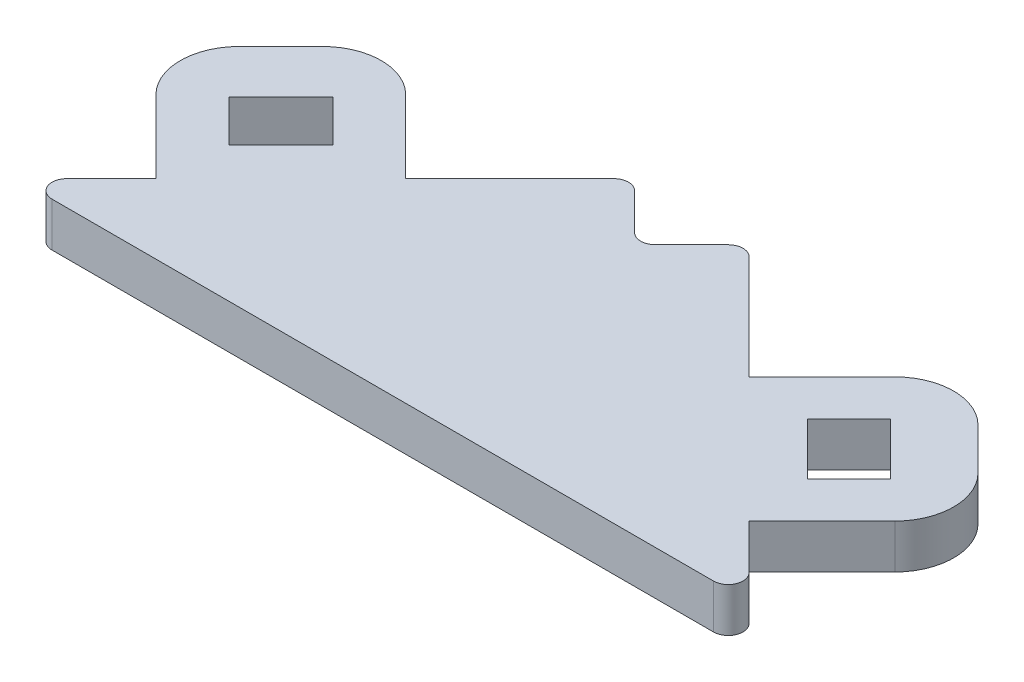
ISO-10303-21;
HEADER;
FILE_DESCRIPTION(('STEP AP214'),'2;1');
FILE_NAME('part.step','',(''),(''),'','','');
FILE_SCHEMA(('AUTOMOTIVE_DESIGN { 1 0 10303 214 1 1 1 1 }'));
ENDSEC;
DATA;
#1=APPLICATION_CONTEXT('core data for automotive mechanical design processes');
#2=APPLICATION_PROTOCOL_DEFINITION('international standard','automotive_design',2000,#1);
#3=PRODUCT_CONTEXT('',#1,'mechanical');
#4=PRODUCT('Part','Part','',(#3));
#5=PRODUCT_RELATED_PRODUCT_CATEGORY('part','',(#4));
#6=PRODUCT_DEFINITION_FORMATION('','',#4);
#7=PRODUCT_DEFINITION_CONTEXT('part definition',#1,'design');
#8=PRODUCT_DEFINITION('design','',#6,#7);
#9=PRODUCT_DEFINITION_SHAPE('','',#8);
#10=(LENGTH_UNIT() NAMED_UNIT(*) SI_UNIT(.MILLI.,.METRE.));
#11=(NAMED_UNIT(*) PLANE_ANGLE_UNIT() SI_UNIT($,.RADIAN.));
#12=(NAMED_UNIT(*) SI_UNIT($,.STERADIAN.) SOLID_ANGLE_UNIT());
#13=UNCERTAINTY_MEASURE_WITH_UNIT(LENGTH_MEASURE(1.E-05),#10,'distance_accuracy_value','');
#14=(GEOMETRIC_REPRESENTATION_CONTEXT(3) GLOBAL_UNCERTAINTY_ASSIGNED_CONTEXT((#13)) GLOBAL_UNIT_ASSIGNED_CONTEXT((#10,
#11,#12)) REPRESENTATION_CONTEXT('',''));
#15=CARTESIAN_POINT('',(0.,0.,0.));
#16=DIRECTION('',(0.,0.,1.));
#17=DIRECTION('',(1.,0.,0.));
#18=AXIS2_PLACEMENT_3D('',#15,#16,#17);
#19=CARTESIAN_POINT('',(167.411152544811,19.05,-133.35));
#20=DIRECTION('',(-0.707106781186547,0.,0.707106781186547));
#21=DIRECTION('',(0.707106781186548,0.,0.707106781186547));
#22=AXIS2_PLACEMENT_3D('',#19,#20,#21);
#23=PLANE('',#22);
#24=DIRECTION('',(-0.707106781186548,0.,-0.707106781186547));
#25=VECTOR('',#24,1.);
#26=CARTESIAN_POINT('',(167.411152544811,0.,-133.35));
#27=LINE('',#26,#25);
#28=CARTESIAN_POINT('',(216.802561210692,0.,-83.9585913341197));
#29=VERTEX_POINT('',#28);
#30=CARTESIAN_POINT('',(171.901280605346,0.,-128.859871939465));
#31=VERTEX_POINT('',#30);
#32=EDGE_CURVE('E316',#29,#31,#27,.T.);
#33=ORIENTED_EDGE('',*,*,#32,.T.);
#34=DIRECTION('',(0.,-1.,0.));
#35=VECTOR('',#34,1.);
#36=CARTESIAN_POINT('',(171.901280605346,19.05,-128.859871939465));
#37=LINE('',#36,#35);
#38=CARTESIAN_POINT('',(171.901280605346,19.05,-128.859871939465));
#39=VERTEX_POINT('',#38);
#40=EDGE_CURVE('E507',#31,#39,#37,.F.);
#41=ORIENTED_EDGE('',*,*,#40,.T.);
#42=DIRECTION('',(-0.707106781186548,0.,-0.707106781186547));
#43=VECTOR('',#42,1.);
#44=CARTESIAN_POINT('',(167.411152544811,19.05,-133.35));
#45=LINE('',#44,#43);
#46=CARTESIAN_POINT('',(216.802561210692,19.05,-83.9585913341197));
#47=VERTEX_POINT('',#46);
#48=EDGE_CURVE('E325',#47,#39,#45,.T.);
#49=ORIENTED_EDGE('',*,*,#48,.F.);
#50=DIRECTION('',(0.,-1.,0.));
#51=VECTOR('',#50,1.);
#52=CARTESIAN_POINT('',(216.802561210692,19.05,-83.9585913341197));
#53=LINE('',#52,#51);
#54=EDGE_CURVE('E370',#47,#29,#53,.T.);
#55=ORIENTED_EDGE('',*,*,#54,.T.);
#56=EDGE_LOOP('',(#33,#41,#49,#55));
#57=FACE_BOUND('',#56,.T.);
#58=ADVANCED_FACE('F34',(#57),#23,.F.);
#59=CARTESIAN_POINT('',(167.411152544811,19.05,-133.35));
#60=DIRECTION('',(0.707106781186548,0.,0.707106781186547));
#61=DIRECTION('',(0.707106781186547,0.,-0.707106781186548));
#62=AXIS2_PLACEMENT_3D('',#59,#60,#61);
#63=PLANE('',#62);
#64=DIRECTION('',(-0.707106781186547,0.,0.707106781186547));
#65=VECTOR('',#64,1.);
#66=CARTESIAN_POINT('',(167.411152544811,0.,-133.35));
#67=LINE('',#66,#65);
#68=CARTESIAN_POINT('',(162.921024484277,0.,-128.859871939465));
#69=VERTEX_POINT('',#68);
#70=CARTESIAN_POINT('',(147.205576272406,0.,-113.144423727594));
#71=VERTEX_POINT('',#70);
#72=EDGE_CURVE('E374',#69,#71,#67,.T.);
#73=ORIENTED_EDGE('',*,*,#72,.T.);
#74=DIRECTION('',(0.,-1.,0.));
#75=VECTOR('',#74,1.);
#76=CARTESIAN_POINT('',(147.205576272406,19.05,-113.144423727594));
#77=LINE('',#76,#75);
#78=CARTESIAN_POINT('',(147.205576272406,19.05,-113.144423727594));
#79=VERTEX_POINT('',#78);
#80=EDGE_CURVE('E505',#71,#79,#77,.F.);
#81=ORIENTED_EDGE('',*,*,#80,.T.);
#82=DIRECTION('',(-0.707106781186547,0.,0.707106781186547));
#83=VECTOR('',#82,1.);
#84=CARTESIAN_POINT('',(167.411152544811,19.05,-133.35));
#85=LINE('',#84,#83);
#86=CARTESIAN_POINT('',(162.921024484277,19.05,-128.859871939465));
#87=VERTEX_POINT('',#86);
#88=EDGE_CURVE('E329',#87,#79,#85,.T.);
#89=ORIENTED_EDGE('',*,*,#88,.F.);
#90=DIRECTION('',(0.,-1.,0.));
#91=VECTOR('',#90,1.);
#92=CARTESIAN_POINT('',(162.921024484277,19.05,-128.859871939465));
#93=LINE('',#92,#91);
#94=EDGE_CURVE('E502',#87,#69,#93,.T.);
#95=ORIENTED_EDGE('',*,*,#94,.T.);
#96=EDGE_LOOP('',(#73,#81,#89,#95));
#97=FACE_BOUND('',#96,.T.);
#98=ADVANCED_FACE('F522',(#97),#63,.F.);
#99=CARTESIAN_POINT('',(142.715448211871,19.05,-108.65429566706));
#100=DIRECTION('',(-0.707106781186547,0.,0.707106781186547));
#101=DIRECTION('',(0.707106781186548,0.,0.707106781186547));
#102=AXIS2_PLACEMENT_3D('',#99,#100,#101);
#103=PLANE('',#102);
#104=DIRECTION('',(-0.707106781186548,0.,-0.707106781186547));
#105=VECTOR('',#104,1.);
#106=CARTESIAN_POINT('',(142.715448211871,19.05,-108.65429566706));
#107=LINE('',#106,#105);
#108=CARTESIAN_POINT('',(138.225320151336,19.05,-113.144423727594));
#109=VERTEX_POINT('',#108);
#110=CARTESIAN_POINT('',(122.509871939465,19.05,-128.859871939465));
#111=VERTEX_POINT('',#110);
#112=EDGE_CURVE('E334',#109,#111,#107,.T.);
#113=ORIENTED_EDGE('',*,*,#112,.F.);
#114=DIRECTION('',(0.,-1.,0.));
#115=VECTOR('',#114,1.);
#116=CARTESIAN_POINT('',(138.225320151336,0.,-113.144423727594));
#117=LINE('',#116,#115);
#118=CARTESIAN_POINT('',(138.225320151336,0.,-113.144423727594));
#119=VERTEX_POINT('',#118);
#120=EDGE_CURVE('E499',#109,#119,#117,.T.);
#121=ORIENTED_EDGE('',*,*,#120,.T.);
#122=DIRECTION('',(-0.707106781186548,0.,-0.707106781186547));
#123=VECTOR('',#122,1.);
#124=CARTESIAN_POINT('',(142.715448211871,0.,-108.65429566706));
#125=LINE('',#124,#123);
#126=CARTESIAN_POINT('',(122.509871939465,0.,-128.859871939465));
#127=VERTEX_POINT('',#126);
#128=EDGE_CURVE('E378',#119,#127,#125,.T.);
#129=ORIENTED_EDGE('',*,*,#128,.T.);
#130=DIRECTION('',(0.,-1.,0.));
#131=VECTOR('',#130,1.);
#132=CARTESIAN_POINT('',(122.509871939465,19.05,-128.859871939465));
#133=LINE('',#132,#131);
#134=EDGE_CURVE('E496',#127,#111,#133,.F.);
#135=ORIENTED_EDGE('',*,*,#134,.T.);
#136=EDGE_LOOP('',(#113,#121,#129,#135));
#137=FACE_BOUND('',#136,.T.);
#138=ADVANCED_FACE('F530',(#137),#103,.F.);
#139=CARTESIAN_POINT('',(118.019743878931,19.05,-133.35));
#140=DIRECTION('',(0.707106781186548,0.,0.707106781186547));
#141=DIRECTION('',(0.707106781186547,0.,-0.707106781186548));
#142=AXIS2_PLACEMENT_3D('',#139,#140,#141);
#143=PLANE('',#142);
#144=DIRECTION('',(-0.707106781186547,0.,0.707106781186547));
#145=VECTOR('',#144,1.);
#146=CARTESIAN_POINT('',(118.019743878931,19.05,-133.35));
#147=LINE('',#146,#145);
#148=CARTESIAN_POINT('',(113.529615818396,19.05,-128.859871939465));
#149=VERTEX_POINT('',#148);
#150=CARTESIAN_POINT('',(68.6283352130505,19.05,-83.9585913341196));
#151=VERTEX_POINT('',#150);
#152=EDGE_CURVE('E337',#149,#151,#147,.T.);
#153=ORIENTED_EDGE('',*,*,#152,.F.);
#154=DIRECTION('',(0.,-1.,0.));
#155=VECTOR('',#154,1.);
#156=CARTESIAN_POINT('',(113.529615818396,19.05,-128.859871939465));
#157=LINE('',#156,#155);
#158=CARTESIAN_POINT('',(113.529615818396,0.,-128.859871939465));
#159=VERTEX_POINT('',#158);
#160=EDGE_CURVE('E509',#149,#159,#157,.T.);
#161=ORIENTED_EDGE('',*,*,#160,.T.);
#162=DIRECTION('',(-0.707106781186547,0.,0.707106781186547));
#163=VECTOR('',#162,1.);
#164=CARTESIAN_POINT('',(118.019743878931,0.,-133.35));
#165=LINE('',#164,#163);
#166=CARTESIAN_POINT('',(68.6283352130505,0.,-83.9585913341196));
#167=VERTEX_POINT('',#166);
#168=EDGE_CURVE('E382',#159,#167,#165,.T.);
#169=ORIENTED_EDGE('',*,*,#168,.T.);
#170=DIRECTION('',(0.,-1.,0.));
#171=VECTOR('',#170,1.);
#172=CARTESIAN_POINT('',(68.6283352130505,19.05,-83.9585913341196));
#173=LINE('',#172,#171);
#174=EDGE_CURVE('E425',#151,#167,#173,.T.);
#175=ORIENTED_EDGE('',*,*,#174,.F.);
#176=EDGE_LOOP('',(#153,#161,#169,#175));
#177=FACE_BOUND('',#176,.T.);
#178=ADVANCED_FACE('F537',(#177),#143,.F.);
#179=CARTESIAN_POINT('',(19.2369265471701,19.05,-133.35));
#180=DIRECTION('',(-0.707106781186547,0.,0.707106781186547));
#181=DIRECTION('',(0.707106781186548,0.,0.707106781186547));
#182=AXIS2_PLACEMENT_3D('',#179,#180,#181);
#183=PLANE('',#182);
#184=DIRECTION('',(-0.707106781186548,0.,-0.707106781186547));
#185=VECTOR('',#184,1.);
#186=CARTESIAN_POINT('',(19.2369265471701,0.,-133.35));
#187=LINE('',#186,#185);
#188=CARTESIAN_POINT('',(37.1974387893084,0.,-115.389487757862));
#189=VERTEX_POINT('',#188);
#190=EDGE_CURVE('E385',#167,#189,#187,.T.);
#191=ORIENTED_EDGE('',*,*,#190,.T.);
#192=DIRECTION('',(0.,-1.,0.));
#193=VECTOR('',#192,1.);
#194=CARTESIAN_POINT('',(37.1974387893084,19.05,-115.389487757862));
#195=LINE('',#194,#193);
#196=CARTESIAN_POINT('',(37.1974387893084,19.05,-115.389487757862));
#197=VERTEX_POINT('',#196);
#198=EDGE_CURVE('E467',#189,#197,#195,.F.);
#199=ORIENTED_EDGE('',*,*,#198,.T.);
#200=DIRECTION('',(-0.707106781186548,0.,-0.707106781186547));
#201=VECTOR('',#200,1.);
#202=CARTESIAN_POINT('',(19.2369265471701,19.05,-133.35));
#203=LINE('',#202,#201);
#204=EDGE_CURVE('E340',#151,#197,#203,.T.);
#205=ORIENTED_EDGE('',*,*,#204,.F.);
#206=ORIENTED_EDGE('',*,*,#174,.T.);
#207=EDGE_LOOP('',(#191,#199,#205,#206));
#208=FACE_BOUND('',#207,.T.);
#209=ADVANCED_FACE('F543',(#208),#183,.F.);
#210=CARTESIAN_POINT('',(-34.6446101792448,19.05,-79.4684632735851));
#211=DIRECTION('',(0.707106781186547,0.,0.707106781186547));
#212=DIRECTION('',(0.707106781186547,0.,-0.707106781186548));
#213=AXIS2_PLACEMENT_3D('',#210,#211,#212);
#214=PLANE('',#213);
#215=DIRECTION('',(-0.707106781186547,0.,0.707106781186548));
#216=VECTOR('',#215,1.);
#217=CARTESIAN_POINT('',(-34.6446101792448,19.05,-79.4684632735851));
#218=LINE('',#217,#216);
#219=CARTESIAN_POINT('',(1.27641430503183,19.05,-115.389487757862));
#220=VERTEX_POINT('',#219);
#221=CARTESIAN_POINT('',(-16.6840979371065,19.05,-97.4289755157234));
#222=VERTEX_POINT('',#221);
#223=EDGE_CURVE('E343',#220,#222,#218,.T.);
#224=ORIENTED_EDGE('',*,*,#223,.F.);
#225=DIRECTION('',(0.,-1.,0.));
#226=VECTOR('',#225,1.);
#227=CARTESIAN_POINT('',(1.27641430503183,19.05,-115.389487757862));
#228=LINE('',#227,#226);
#229=CARTESIAN_POINT('',(1.27641430503183,0.,-115.389487757862));
#230=VERTEX_POINT('',#229);
#231=EDGE_CURVE('E464',#220,#230,#228,.T.);
#232=ORIENTED_EDGE('',*,*,#231,.T.);
#233=DIRECTION('',(-0.707106781186547,0.,0.707106781186548));
#234=VECTOR('',#233,1.);
#235=CARTESIAN_POINT('',(-34.6446101792448,0.,-79.4684632735851));
#236=LINE('',#235,#234);
#237=CARTESIAN_POINT('',(-16.6840979371065,0.,-97.4289755157234));
#238=VERTEX_POINT('',#237);
#239=EDGE_CURVE('E389',#230,#238,#236,.T.);
#240=ORIENTED_EDGE('',*,*,#239,.T.);
#241=DIRECTION('',(0.,-1.,0.));
#242=VECTOR('',#241,1.);
#243=CARTESIAN_POINT('',(-16.6840979371065,19.05,-97.4289755157234));
#244=LINE('',#243,#242);
#245=EDGE_CURVE('E461',#238,#222,#244,.F.);
#246=ORIENTED_EDGE('',*,*,#245,.T.);
#247=EDGE_LOOP('',(#224,#232,#240,#246));
#248=FACE_BOUND('',#247,.T.);
#249=ADVANCED_FACE('F552',(#248),#214,.F.);
#250=CARTESIAN_POINT('',(-34.6446101792448,19.05,-79.4684632735851));
#251=DIRECTION('',(0.707106781186547,0.,-0.707106781186547));
#252=DIRECTION('',(-0.707106781186548,0.,-0.707106781186547));
#253=AXIS2_PLACEMENT_3D('',#250,#251,#252);
#254=PLANE('',#253);
#255=DIRECTION('',(0.707106781186548,0.,0.707106781186547));
#256=VECTOR('',#255,1.);
#257=CARTESIAN_POINT('',(-34.6446101792448,19.05,-79.4684632735851));
#258=LINE('',#257,#256);
#259=CARTESIAN_POINT('',(-16.6840979371065,19.05,-61.5079510314468));
#260=VERTEX_POINT('',#259);
#261=CARTESIAN_POINT('',(14.7467984866356,19.05,-30.0770546077048));
#262=VERTEX_POINT('',#261);
#263=EDGE_CURVE('E347',#260,#262,#258,.T.);
#264=ORIENTED_EDGE('',*,*,#263,.F.);
#265=DIRECTION('',(0.,-1.,0.));
#266=VECTOR('',#265,1.);
#267=CARTESIAN_POINT('',(-16.6840979371065,19.05,-61.5079510314468));
#268=LINE('',#267,#266);
#269=CARTESIAN_POINT('',(-16.6840979371065,0.,-61.5079510314468));
#270=VERTEX_POINT('',#269);
#271=EDGE_CURVE('E470',#260,#270,#268,.T.);
#272=ORIENTED_EDGE('',*,*,#271,.T.);
#273=DIRECTION('',(0.707106781186548,0.,0.707106781186547));
#274=VECTOR('',#273,1.);
#275=CARTESIAN_POINT('',(-34.6446101792448,0.,-79.4684632735851));
#276=LINE('',#275,#274);
#277=CARTESIAN_POINT('',(14.7467984866356,0.,-30.0770546077048));
#278=VERTEX_POINT('',#277);
#279=EDGE_CURVE('E393',#270,#278,#276,.T.);
#280=ORIENTED_EDGE('',*,*,#279,.T.);
#281=DIRECTION('',(0.,-1.,0.));
#282=VECTOR('',#281,1.);
#283=CARTESIAN_POINT('',(14.7467984866356,19.05,-30.0770546077048));
#284=LINE('',#283,#282);
#285=EDGE_CURVE('E421',#262,#278,#284,.T.);
#286=ORIENTED_EDGE('',*,*,#285,.F.);
#287=EDGE_LOOP('',(#264,#272,#280,#286));
#288=FACE_BOUND('',#287,.T.);
#289=ADVANCED_FACE('F560',(#288),#254,.F.);
#290=CARTESIAN_POINT('',(14.7467984866356,19.05,-30.0770546077048));
#291=DIRECTION('',(0.707106781186547,0.,0.707106781186547));
#292=DIRECTION('',(0.707106781186547,0.,-0.707106781186548));
#293=AXIS2_PLACEMENT_3D('',#290,#291,#292);
#294=PLANE('',#293);
#295=DIRECTION('',(-0.707106781186547,0.,0.707106781186548));
#296=VECTOR('',#295,1.);
#297=CARTESIAN_POINT('',(14.7467984866356,0.,-30.0770546077048));
#298=LINE('',#297,#296);
#299=CARTESIAN_POINT('',(-4.49012806053458,0.,-10.8401280605346));
#300=VERTEX_POINT('',#299);
#301=EDGE_CURVE('E396',#278,#300,#298,.T.);
#302=ORIENTED_EDGE('',*,*,#301,.T.);
#303=DIRECTION('',(0.,-1.,0.));
#304=VECTOR('',#303,1.);
#305=CARTESIAN_POINT('',(-4.49012806053458,19.05,-10.8401280605346));
#306=LINE('',#305,#304);
#307=CARTESIAN_POINT('',(-4.49012806053458,19.05,-10.8401280605346));
#308=VERTEX_POINT('',#307);
#309=EDGE_CURVE('E49',#300,#308,#306,.F.);
#310=ORIENTED_EDGE('',*,*,#309,.T.);
#311=DIRECTION('',(-0.707106781186547,0.,0.707106781186548));
#312=VECTOR('',#311,1.);
#313=CARTESIAN_POINT('',(14.7467984866356,19.05,-30.0770546077048));
#314=LINE('',#313,#312);
#315=EDGE_CURVE('E350',#262,#308,#314,.T.);
#316=ORIENTED_EDGE('',*,*,#315,.F.);
#317=ORIENTED_EDGE('',*,*,#285,.T.);
#318=EDGE_LOOP('',(#302,#310,#316,#317));
#319=FACE_BOUND('',#318,.T.);
#320=ADVANCED_FACE('F563',(#319),#294,.F.);
#321=CARTESIAN_POINT('',(-15.3302561210692,19.05,0.));
#322=DIRECTION('',(0.,0.,-1.));
#323=DIRECTION('',(-1.,0.,0.));
#324=AXIS2_PLACEMENT_3D('',#321,#322,#323);
#325=PLANE('',#324);
#326=DIRECTION('',(1.,0.,0.));
#327=VECTOR('',#326,1.);
#328=CARTESIAN_POINT('',(-15.3302561210692,0.,0.));
#329=LINE('',#328,#327);
#330=CARTESIAN_POINT('',(0.,0.,0.));
#331=VERTEX_POINT('',#330);
#332=CARTESIAN_POINT('',(285.430896423742,0.,0.));
#333=VERTEX_POINT('',#332);
#334=EDGE_CURVE('E399',#331,#333,#329,.T.);
#335=ORIENTED_EDGE('',*,*,#334,.T.);
#336=DIRECTION('',(0.,-1.,0.));
#337=VECTOR('',#336,1.);
#338=CARTESIAN_POINT('',(285.430896423742,19.05,0.));
#339=LINE('',#338,#337);
#340=CARTESIAN_POINT('',(285.430896423742,19.05,0.));
#341=VERTEX_POINT('',#340);
#342=EDGE_CURVE('E487',#333,#341,#339,.F.);
#343=ORIENTED_EDGE('',*,*,#342,.T.);
#344=DIRECTION('',(1.,0.,0.));
#345=VECTOR('',#344,1.);
#346=CARTESIAN_POINT('',(-15.3302561210692,19.05,0.));
#347=LINE('',#346,#345);
#348=CARTESIAN_POINT('',(0.,19.05,0.));
#349=VERTEX_POINT('',#348);
#350=EDGE_CURVE('E352',#349,#341,#347,.T.);
#351=ORIENTED_EDGE('',*,*,#350,.F.);
#352=DIRECTION('',(0.,-1.,0.));
#353=VECTOR('',#352,1.);
#354=CARTESIAN_POINT('',(0.,19.05,0.));
#355=LINE('',#354,#353);
#356=EDGE_CURVE('E484',#349,#331,#355,.T.);
#357=ORIENTED_EDGE('',*,*,#356,.T.);
#358=EDGE_LOOP('',(#335,#343,#351,#357));
#359=FACE_BOUND('',#358,.T.);
#360=ADVANCED_FACE('F570',(#359),#325,.F.);
#361=CARTESIAN_POINT('',(300.761152544811,19.05,0.));
#362=DIRECTION('',(-0.707106781186547,0.,0.707106781186547));
#363=DIRECTION('',(0.707106781186548,0.,0.707106781186547));
#364=AXIS2_PLACEMENT_3D('',#361,#362,#363);
#365=PLANE('',#364);
#366=DIRECTION('',(-0.707106781186548,0.,-0.707106781186547));
#367=VECTOR('',#366,1.);
#368=CARTESIAN_POINT('',(300.761152544811,19.05,0.));
#369=LINE('',#368,#367);
#370=CARTESIAN_POINT('',(289.921024484277,19.05,-10.8401280605346));
#371=VERTEX_POINT('',#370);
#372=CARTESIAN_POINT('',(270.684097937106,19.05,-30.0770546077048));
#373=VERTEX_POINT('',#372);
#374=EDGE_CURVE('E356',#371,#373,#369,.T.);
#375=ORIENTED_EDGE('',*,*,#374,.F.);
#376=DIRECTION('',(0.,-1.,0.));
#377=VECTOR('',#376,1.);
#378=CARTESIAN_POINT('',(289.921024484277,19.05,-10.8401280605346));
#379=LINE('',#378,#377);
#380=CARTESIAN_POINT('',(289.921024484277,0.,-10.8401280605346));
#381=VERTEX_POINT('',#380);
#382=EDGE_CURVE('E473',#371,#381,#379,.T.);
#383=ORIENTED_EDGE('',*,*,#382,.T.);
#384=DIRECTION('',(-0.707106781186548,0.,-0.707106781186547));
#385=VECTOR('',#384,1.);
#386=CARTESIAN_POINT('',(300.761152544811,0.,0.));
#387=LINE('',#386,#385);
#388=CARTESIAN_POINT('',(270.684097937106,0.,-30.0770546077048));
#389=VERTEX_POINT('',#388);
#390=EDGE_CURVE('E403',#381,#389,#387,.T.);
#391=ORIENTED_EDGE('',*,*,#390,.T.);
#392=DIRECTION('',(0.,-1.,0.));
#393=VECTOR('',#392,1.);
#394=CARTESIAN_POINT('',(270.684097937106,19.05,-30.0770546077048));
#395=LINE('',#394,#393);
#396=EDGE_CURVE('E417',#373,#389,#395,.T.);
#397=ORIENTED_EDGE('',*,*,#396,.F.);
#398=EDGE_LOOP('',(#375,#383,#391,#397));
#399=FACE_BOUND('',#398,.T.);
#400=ADVANCED_FACE('F579',(#399),#365,.F.);
#401=CARTESIAN_POINT('',(270.684097937106,19.05,-30.0770546077048));
#402=DIRECTION('',(-0.707106781186547,0.,-0.707106781186547));
#403=DIRECTION('',(-0.707106781186547,0.,0.707106781186548));
#404=AXIS2_PLACEMENT_3D('',#401,#402,#403);
#405=PLANE('',#404);
#406=DIRECTION('',(0.707106781186547,0.,-0.707106781186548));
#407=VECTOR('',#406,1.);
#408=CARTESIAN_POINT('',(270.684097937106,0.,-30.0770546077048));
#409=LINE('',#408,#407);
#410=CARTESIAN_POINT('',(302.114994360848,0.,-61.5079510314468));
#411=VERTEX_POINT('',#410);
#412=EDGE_CURVE('E405',#389,#411,#409,.T.);
#413=ORIENTED_EDGE('',*,*,#412,.T.);
#414=DIRECTION('',(0.,-1.,0.));
#415=VECTOR('',#414,1.);
#416=CARTESIAN_POINT('',(302.114994360848,19.05,-61.5079510314468));
#417=LINE('',#416,#415);
#418=CARTESIAN_POINT('',(302.114994360848,19.05,-61.5079510314468));
#419=VERTEX_POINT('',#418);
#420=EDGE_CURVE('E459',#411,#419,#417,.F.);
#421=ORIENTED_EDGE('',*,*,#420,.T.);
#422=DIRECTION('',(0.707106781186547,0.,-0.707106781186548));
#423=VECTOR('',#422,1.);
#424=CARTESIAN_POINT('',(270.684097937106,19.05,-30.0770546077048));
#425=LINE('',#424,#423);
#426=EDGE_CURVE('E359',#373,#419,#425,.T.);
#427=ORIENTED_EDGE('',*,*,#426,.F.);
#428=ORIENTED_EDGE('',*,*,#396,.T.);
#429=EDGE_LOOP('',(#413,#421,#427,#428));
#430=FACE_BOUND('',#429,.T.);
#431=ADVANCED_FACE('F797',(#430),#405,.F.);
#432=CARTESIAN_POINT('',(266.193969876572,19.05,-133.35));
#433=DIRECTION('',(-0.707106781186547,0.,0.707106781186548));
#434=DIRECTION('',(0.707106781186548,0.,0.707106781186547));
#435=AXIS2_PLACEMENT_3D('',#432,#433,#434);
#436=PLANE('',#435);
#437=DIRECTION('',(-0.707106781186547,0.,-0.707106781186547));
#438=VECTOR('',#437,1.);
#439=CARTESIAN_POINT('',(266.193969876572,0.,-133.35));
#440=LINE('',#439,#438);
#441=CARTESIAN_POINT('',(302.114994360848,0.,-97.4289755157234));
#442=VERTEX_POINT('',#441);
#443=CARTESIAN_POINT('',(284.15448211871,0.,-115.389487757862));
#444=VERTEX_POINT('',#443);
#445=EDGE_CURVE('E409',#442,#444,#440,.T.);
#446=ORIENTED_EDGE('',*,*,#445,.T.);
#447=DIRECTION('',(0.,-1.,0.));
#448=VECTOR('',#447,1.);
#449=CARTESIAN_POINT('',(284.15448211871,19.05,-115.389487757862));
#450=LINE('',#449,#448);
#451=CARTESIAN_POINT('',(284.15448211871,19.05,-115.389487757862));
#452=VERTEX_POINT('',#451);
#453=EDGE_CURVE('E446',#444,#452,#450,.F.);
#454=ORIENTED_EDGE('',*,*,#453,.T.);
#455=DIRECTION('',(-0.707106781186547,0.,-0.707106781186547));
#456=VECTOR('',#455,1.);
#457=CARTESIAN_POINT('',(266.193969876572,19.05,-133.35));
#458=LINE('',#457,#456);
#459=CARTESIAN_POINT('',(302.114994360848,19.05,-97.4289755157234));
#460=VERTEX_POINT('',#459);
#461=EDGE_CURVE('E363',#460,#452,#458,.T.);
#462=ORIENTED_EDGE('',*,*,#461,.F.);
#463=DIRECTION('',(0.,-1.,0.));
#464=VECTOR('',#463,1.);
#465=CARTESIAN_POINT('',(302.114994360848,19.05,-97.4289755157234));
#466=LINE('',#465,#464);
#467=EDGE_CURVE('E442',#460,#442,#466,.T.);
#468=ORIENTED_EDGE('',*,*,#467,.T.);
#469=EDGE_LOOP('',(#446,#454,#462,#468));
#470=FACE_BOUND('',#469,.T.);
#471=ADVANCED_FACE('F591',(#470),#436,.F.);
#472=CARTESIAN_POINT('',(216.802561210692,19.05,-83.9585913341197));
#473=DIRECTION('',(0.707106781186547,0.,0.707106781186547));
#474=DIRECTION('',(0.707106781186547,0.,-0.707106781186548));
#475=AXIS2_PLACEMENT_3D('',#472,#473,#474);
#476=PLANE('',#475);
#477=DIRECTION('',(-0.707106781186547,0.,0.707106781186548));
#478=VECTOR('',#477,1.);
#479=CARTESIAN_POINT('',(216.802561210692,19.05,-83.9585913341197));
#480=LINE('',#479,#478);
#481=CARTESIAN_POINT('',(248.233457634434,19.05,-115.389487757862));
#482=VERTEX_POINT('',#481);
#483=EDGE_CURVE('E367',#482,#47,#480,.T.);
#484=ORIENTED_EDGE('',*,*,#483,.F.);
#485=DIRECTION('',(0.,-1.,0.));
#486=VECTOR('',#485,1.);
#487=CARTESIAN_POINT('',(248.233457634434,19.05,-115.389487757862));
#488=LINE('',#487,#486);
#489=CARTESIAN_POINT('',(248.233457634434,0.,-115.389487757862));
#490=VERTEX_POINT('',#489);
#491=EDGE_CURVE('E429',#482,#490,#488,.T.);
#492=ORIENTED_EDGE('',*,*,#491,.T.);
#493=DIRECTION('',(-0.707106781186547,0.,0.707106781186548));
#494=VECTOR('',#493,1.);
#495=CARTESIAN_POINT('',(216.802561210692,0.,-83.9585913341197));
#496=LINE('',#495,#494);
#497=EDGE_CURVE('E330',#490,#29,#496,.T.);
#498=ORIENTED_EDGE('',*,*,#497,.T.);
#499=ORIENTED_EDGE('',*,*,#54,.F.);
#500=EDGE_LOOP('',(#484,#492,#498,#499));
#501=FACE_BOUND('',#500,.T.);
#502=ADVANCED_FACE('F601',(#501),#476,.F.);
#503=CARTESIAN_POINT('',(-15.3302561210692,19.05,0.));
#504=DIRECTION('',(0.,1.,0.));
#505=DIRECTION('',(-0.707106781186547,0.,0.707106781186548));
#506=AXIS2_PLACEMENT_3D('',#503,#504,#505);
#507=PLANE('',#506);
#508=DIRECTION('',(-0.707106781186547,0.,0.707106781186548));
#509=VECTOR('',#508,1.);
#510=CARTESIAN_POINT('',(245.090367992059,19.05,-80.8155016917455));
#511=LINE('',#510,#509);
#512=CARTESIAN_POINT('',(263.050880234198,19.05,-98.7760139338838));
#513=VERTEX_POINT('',#512);
#514=CARTESIAN_POINT('',(245.090367992059,19.05,-80.8155016917455));
#515=VERTEX_POINT('',#514);
#516=EDGE_CURVE('E240',#513,#515,#511,.T.);
#517=ORIENTED_EDGE('',*,*,#516,.F.);
#518=DIRECTION('',(-0.707106781186548,0.,-0.707106781186547));
#519=VECTOR('',#518,1.);
#520=CARTESIAN_POINT('',(263.050880234198,19.05,-98.7760139338838));
#521=LINE('',#520,#519);
#522=CARTESIAN_POINT('',(285.501520536871,19.05,-76.3253736312109));
#523=VERTEX_POINT('',#522);
#524=EDGE_CURVE('E260',#523,#513,#521,.T.);
#525=ORIENTED_EDGE('',*,*,#524,.F.);
#526=DIRECTION('',(0.707106781186547,0.,-0.707106781186548));
#527=VECTOR('',#526,1.);
#528=CARTESIAN_POINT('',(267.541008294732,19.05,-58.3648613890726));
#529=LINE('',#528,#527);
#530=CARTESIAN_POINT('',(267.541008294732,19.05,-58.3648613890726));
#531=VERTEX_POINT('',#530);
#532=EDGE_CURVE('E264',#531,#523,#529,.T.);
#533=ORIENTED_EDGE('',*,*,#532,.F.);
#534=DIRECTION('',(0.707106781186548,0.,0.707106781186547));
#535=VECTOR('',#534,1.);
#536=CARTESIAN_POINT('',(245.090367992059,19.05,-80.8155016917455));
#537=LINE('',#536,#535);
#538=EDGE_CURVE('E272',#515,#531,#537,.T.);
#539=ORIENTED_EDGE('',*,*,#538,.F.);
#540=EDGE_LOOP('',(#517,#525,#533,#539));
#541=FACE_BOUND('',#540,.T.);
#542=DIRECTION('',(-0.707106781186547,0.,0.707106781186548));
#543=VECTOR('',#542,1.);
#544=CARTESIAN_POINT('',(22.3800161895444,19.05,-98.7760139338838));
#545=LINE('',#544,#543);
#546=CARTESIAN_POINT('',(22.3800161895444,19.05,-98.7760139338838));
#547=VERTEX_POINT('',#546);
#548=CARTESIAN_POINT('',(-0.070624113128517,19.05,-76.3253736312109));
#549=VERTEX_POINT('',#548);
#550=EDGE_CURVE('E281',#547,#549,#545,.T.);
#551=ORIENTED_EDGE('',*,*,#550,.F.);
#552=DIRECTION('',(-0.707106781186548,0.,-0.707106781186547));
#553=VECTOR('',#552,1.);
#554=CARTESIAN_POINT('',(22.3800161895444,19.05,-98.7760139338838));
#555=LINE('',#554,#553);
#556=CARTESIAN_POINT('',(40.3405284316827,19.05,-80.8155016917455));
#557=VERTEX_POINT('',#556);
#558=EDGE_CURVE('E290',#557,#547,#555,.T.);
#559=ORIENTED_EDGE('',*,*,#558,.F.);
#560=DIRECTION('',(0.707106781186547,0.,-0.707106781186548));
#561=VECTOR('',#560,1.);
#562=CARTESIAN_POINT('',(40.3405284316827,19.05,-80.8155016917455));
#563=LINE('',#562,#561);
#564=CARTESIAN_POINT('',(17.8898881290098,19.05,-58.3648613890726));
#565=VERTEX_POINT('',#564);
#566=EDGE_CURVE('E306',#565,#557,#563,.T.);
#567=ORIENTED_EDGE('',*,*,#566,.F.);
#568=DIRECTION('',(0.707106781186548,0.,0.707106781186547));
#569=VECTOR('',#568,1.);
#570=CARTESIAN_POINT('',(-0.070624113128517,19.05,-76.3253736312109));
#571=LINE('',#570,#569);
#572=EDGE_CURVE('E303',#549,#565,#571,.T.);
#573=ORIENTED_EDGE('',*,*,#572,.F.);
#574=EDGE_LOOP('',(#551,#559,#567,#573));
#575=FACE_BOUND('',#574,.T.);
#576=ORIENTED_EDGE('',*,*,#350,.T.);
#577=CARTESIAN_POINT('',(285.430896423742,19.05,-6.35000000000005));
#578=DIRECTION('',(0.,1.,0.));
#579=DIRECTION('',(-0.707106781186547,0.,0.707106781186548));
#580=AXIS2_PLACEMENT_3D('',#577,#578,#579);
#581=CIRCLE('',#580,6.35);
#582=EDGE_CURVE('E494',#341,#371,#581,.T.);
#583=ORIENTED_EDGE('',*,*,#582,.T.);
#584=ORIENTED_EDGE('',*,*,#374,.T.);
#585=ORIENTED_EDGE('',*,*,#426,.T.);
#586=CARTESIAN_POINT('',(284.15448211871,19.05,-79.4684632735851));
#587=DIRECTION('',(0.,1.,0.));
#588=DIRECTION('',(-0.707106781186547,0.,0.707106781186548));
#589=AXIS2_PLACEMENT_3D('',#586,#587,#588);
#590=CIRCLE('',#589,25.4);
#591=EDGE_CURVE('E454',#419,#460,#590,.T.);
#592=ORIENTED_EDGE('',*,*,#591,.T.);
#593=ORIENTED_EDGE('',*,*,#461,.T.);
#594=CARTESIAN_POINT('',(266.193969876572,19.05,-97.4289755157234));
#595=DIRECTION('',(0.,1.,0.));
#596=DIRECTION('',(-0.707106781186547,0.,0.707106781186548));
#597=AXIS2_PLACEMENT_3D('',#594,#595,#596);
#598=CIRCLE('',#597,25.4);
#599=EDGE_CURVE('E456',#452,#482,#598,.T.);
#600=ORIENTED_EDGE('',*,*,#599,.T.);
#601=ORIENTED_EDGE('',*,*,#483,.T.);
#602=ORIENTED_EDGE('',*,*,#48,.T.);
#603=CARTESIAN_POINT('',(167.411152544811,19.05,-124.369743878931));
#604=DIRECTION('',(0.,1.,0.));
#605=DIRECTION('',(-0.707106781186547,0.,0.707106781186548));
#606=AXIS2_PLACEMENT_3D('',#603,#604,#605);
#607=CIRCLE('',#606,6.35);
#608=EDGE_CURVE('E492',#39,#87,#607,.T.);
#609=ORIENTED_EDGE('',*,*,#608,.T.);
#610=ORIENTED_EDGE('',*,*,#88,.T.);
#611=CARTESIAN_POINT('',(142.715448211871,19.05,-117.634551788129));
#612=DIRECTION('',(0.,1.,0.));
#613=DIRECTION('',(-0.707106781186547,0.,0.707106781186548));
#614=AXIS2_PLACEMENT_3D('',#611,#612,#613);
#615=CIRCLE('',#614,6.35);
#616=EDGE_CURVE('E11',#79,#109,#615,.F.);
#617=ORIENTED_EDGE('',*,*,#616,.T.);
#618=ORIENTED_EDGE('',*,*,#112,.T.);
#619=CARTESIAN_POINT('',(118.019743878931,19.05,-124.369743878931));
#620=DIRECTION('',(0.,1.,0.));
#621=DIRECTION('',(-0.707106781186547,0.,0.707106781186548));
#622=AXIS2_PLACEMENT_3D('',#619,#620,#621);
#623=CIRCLE('',#622,6.35);
#624=EDGE_CURVE('E57',#111,#149,#623,.T.);
#625=ORIENTED_EDGE('',*,*,#624,.T.);
#626=ORIENTED_EDGE('',*,*,#152,.T.);
#627=ORIENTED_EDGE('',*,*,#204,.T.);
#628=CARTESIAN_POINT('',(19.2369265471701,19.05,-97.4289755157234));
#629=DIRECTION('',(0.,1.,0.));
#630=DIRECTION('',(-0.707106781186547,0.,0.707106781186548));
#631=AXIS2_PLACEMENT_3D('',#628,#629,#630);
#632=CIRCLE('',#631,25.4);
#633=EDGE_CURVE('E451',#197,#220,#632,.T.);
#634=ORIENTED_EDGE('',*,*,#633,.T.);
#635=ORIENTED_EDGE('',*,*,#223,.T.);
#636=CARTESIAN_POINT('',(1.27641430503185,19.05,-79.4684632735851));
#637=DIRECTION('',(0.,1.,0.));
#638=DIRECTION('',(-0.707106781186547,0.,0.707106781186548));
#639=AXIS2_PLACEMENT_3D('',#636,#637,#638);
#640=CIRCLE('',#639,25.4);
#641=EDGE_CURVE('E449',#222,#260,#640,.T.);
#642=ORIENTED_EDGE('',*,*,#641,.T.);
#643=ORIENTED_EDGE('',*,*,#263,.T.);
#644=ORIENTED_EDGE('',*,*,#315,.T.);
#645=CARTESIAN_POINT('',(0.,19.05,-6.35));
#646=DIRECTION('',(0.,1.,0.));
#647=DIRECTION('',(-0.707106781186547,0.,0.707106781186548));
#648=AXIS2_PLACEMENT_3D('',#645,#646,#647);
#649=CIRCLE('',#648,6.35);
#650=EDGE_CURVE('E489',#308,#349,#649,.T.);
#651=ORIENTED_EDGE('',*,*,#650,.T.);
#652=EDGE_LOOP('',(#576,#583,#584,#585,#592,#593,#600,#601,#602,#609,#610,#617,#618,#625,#626,
#627,#634,#635,#642,#643,#644,#651));
#653=FACE_BOUND('',#652,.T.);
#654=ADVANCED_FACE('F528',(#541,#575,#653),#507,.T.);
#655=CARTESIAN_POINT('',(-15.3302561210692,0.,0.));
#656=DIRECTION('',(0.,1.,0.));
#657=DIRECTION('',(-0.707106781186547,0.,0.707106781186548));
#658=AXIS2_PLACEMENT_3D('',#655,#656,#657);
#659=PLANE('',#658);
#660=DIRECTION('',(-0.707106781186548,0.,-0.707106781186547));
#661=VECTOR('',#660,1.);
#662=CARTESIAN_POINT('',(263.050880234198,0.,-98.7760139338838));
#663=LINE('',#662,#661);
#664=CARTESIAN_POINT('',(285.501520536871,0.,-76.3253736312109));
#665=VERTEX_POINT('',#664);
#666=CARTESIAN_POINT('',(263.050880234198,0.,-98.7760139338838));
#667=VERTEX_POINT('',#666);
#668=EDGE_CURVE('E246',#665,#667,#663,.T.);
#669=ORIENTED_EDGE('',*,*,#668,.T.);
#670=DIRECTION('',(-0.707106781186547,0.,0.707106781186548));
#671=VECTOR('',#670,1.);
#672=CARTESIAN_POINT('',(245.090367992059,0.,-80.8155016917455));
#673=LINE('',#672,#671);
#674=CARTESIAN_POINT('',(245.090367992059,0.,-80.8155016917455));
#675=VERTEX_POINT('',#674);
#676=EDGE_CURVE('E237',#667,#675,#673,.T.);
#677=ORIENTED_EDGE('',*,*,#676,.T.);
#678=DIRECTION('',(0.707106781186548,0.,0.707106781186547));
#679=VECTOR('',#678,1.);
#680=CARTESIAN_POINT('',(245.090367992059,0.,-80.8155016917455));
#681=LINE('',#680,#679);
#682=CARTESIAN_POINT('',(267.541008294732,0.,-58.3648613890726));
#683=VERTEX_POINT('',#682);
#684=EDGE_CURVE('E250',#675,#683,#681,.T.);
#685=ORIENTED_EDGE('',*,*,#684,.T.);
#686=DIRECTION('',(0.707106781186547,0.,-0.707106781186548));
#687=VECTOR('',#686,1.);
#688=CARTESIAN_POINT('',(267.541008294732,0.,-58.3648613890726));
#689=LINE('',#688,#687);
#690=EDGE_CURVE('E255',#683,#665,#689,.T.);
#691=ORIENTED_EDGE('',*,*,#690,.T.);
#692=EDGE_LOOP('',(#669,#677,#685,#691));
#693=FACE_BOUND('',#692,.T.);
#694=DIRECTION('',(-0.707106781186548,0.,-0.707106781186547));
#695=VECTOR('',#694,1.);
#696=CARTESIAN_POINT('',(22.3800161895444,0.,-98.7760139338838));
#697=LINE('',#696,#695);
#698=CARTESIAN_POINT('',(40.3405284316827,0.,-80.8155016917455));
#699=VERTEX_POINT('',#698);
#700=CARTESIAN_POINT('',(22.3800161895444,0.,-98.7760139338838));
#701=VERTEX_POINT('',#700);
#702=EDGE_CURVE('E296',#699,#701,#697,.T.);
#703=ORIENTED_EDGE('',*,*,#702,.T.);
#704=DIRECTION('',(-0.707106781186547,0.,0.707106781186548));
#705=VECTOR('',#704,1.);
#706=CARTESIAN_POINT('',(22.3800161895444,0.,-98.7760139338838));
#707=LINE('',#706,#705);
#708=CARTESIAN_POINT('',(-0.070624113128517,0.,-76.3253736312109));
#709=VERTEX_POINT('',#708);
#710=EDGE_CURVE('E286',#701,#709,#707,.T.);
#711=ORIENTED_EDGE('',*,*,#710,.T.);
#712=DIRECTION('',(0.707106781186548,0.,0.707106781186547));
#713=VECTOR('',#712,1.);
#714=CARTESIAN_POINT('',(-0.070624113128517,0.,-76.3253736312109));
#715=LINE('',#714,#713);
#716=CARTESIAN_POINT('',(17.8898881290098,0.,-58.3648613890726));
#717=VERTEX_POINT('',#716);
#718=EDGE_CURVE('E289',#709,#717,#715,.T.);
#719=ORIENTED_EDGE('',*,*,#718,.T.);
#720=DIRECTION('',(0.707106781186547,0.,-0.707106781186548));
#721=VECTOR('',#720,1.);
#722=CARTESIAN_POINT('',(40.3405284316827,0.,-80.8155016917455));
#723=LINE('',#722,#721);
#724=EDGE_CURVE('E293',#717,#699,#723,.T.);
#725=ORIENTED_EDGE('',*,*,#724,.T.);
#726=EDGE_LOOP('',(#703,#711,#719,#725));
#727=FACE_BOUND('',#726,.T.);
#728=ORIENTED_EDGE('',*,*,#390,.F.);
#729=CARTESIAN_POINT('',(285.430896423742,0.,-6.35000000000005));
#730=DIRECTION('',(0.,1.,0.));
#731=DIRECTION('',(-0.707106781186547,0.,0.707106781186548));
#732=AXIS2_PLACEMENT_3D('',#729,#730,#731);
#733=CIRCLE('',#732,6.35);
#734=EDGE_CURVE('E482',#381,#333,#733,.F.);
#735=ORIENTED_EDGE('',*,*,#734,.T.);
#736=ORIENTED_EDGE('',*,*,#334,.F.);
#737=CARTESIAN_POINT('',(0.,0.,-6.35));
#738=DIRECTION('',(0.,1.,0.));
#739=DIRECTION('',(-0.707106781186547,0.,0.707106781186548));
#740=AXIS2_PLACEMENT_3D('',#737,#738,#739);
#741=CIRCLE('',#740,6.35);
#742=EDGE_CURVE('E476',#331,#300,#741,.F.);
#743=ORIENTED_EDGE('',*,*,#742,.T.);
#744=ORIENTED_EDGE('',*,*,#301,.F.);
#745=ORIENTED_EDGE('',*,*,#279,.F.);
#746=CARTESIAN_POINT('',(1.27641430503185,0.,-79.4684632735851));
#747=DIRECTION('',(0.,1.,0.));
#748=DIRECTION('',(-0.707106781186547,0.,0.707106781186548));
#749=AXIS2_PLACEMENT_3D('',#746,#747,#748);
#750=CIRCLE('',#749,25.4);
#751=EDGE_CURVE('E433',#270,#238,#750,.F.);
#752=ORIENTED_EDGE('',*,*,#751,.T.);
#753=ORIENTED_EDGE('',*,*,#239,.F.);
#754=CARTESIAN_POINT('',(19.2369265471701,0.,-97.4289755157234));
#755=DIRECTION('',(0.,1.,0.));
#756=DIRECTION('',(-0.707106781186547,0.,0.707106781186548));
#757=AXIS2_PLACEMENT_3D('',#754,#755,#756);
#758=CIRCLE('',#757,25.4);
#759=EDGE_CURVE('E435',#230,#189,#758,.F.);
#760=ORIENTED_EDGE('',*,*,#759,.T.);
#761=ORIENTED_EDGE('',*,*,#190,.F.);
#762=ORIENTED_EDGE('',*,*,#168,.F.);
#763=CARTESIAN_POINT('',(118.019743878931,0.,-124.369743878931));
#764=DIRECTION('',(0.,1.,0.));
#765=DIRECTION('',(-0.707106781186547,0.,0.707106781186548));
#766=AXIS2_PLACEMENT_3D('',#763,#764,#765);
#767=CIRCLE('',#766,6.35);
#768=EDGE_CURVE('E478',#159,#127,#767,.F.);
#769=ORIENTED_EDGE('',*,*,#768,.T.);
#770=ORIENTED_EDGE('',*,*,#128,.F.);
#771=CARTESIAN_POINT('',(142.715448211871,0.,-117.634551788129));
#772=DIRECTION('',(0.,1.,0.));
#773=DIRECTION('',(-0.707106781186547,0.,0.707106781186548));
#774=AXIS2_PLACEMENT_3D('',#771,#772,#773);
#775=CIRCLE('',#774,6.35);
#776=EDGE_CURVE('E42',#119,#71,#775,.T.);
#777=ORIENTED_EDGE('',*,*,#776,.T.);
#778=ORIENTED_EDGE('',*,*,#72,.F.);
#779=CARTESIAN_POINT('',(167.411152544811,0.,-124.369743878931));
#780=DIRECTION('',(0.,1.,0.));
#781=DIRECTION('',(-0.707106781186547,0.,0.707106781186548));
#782=AXIS2_PLACEMENT_3D('',#779,#780,#781);
#783=CIRCLE('',#782,6.35);
#784=EDGE_CURVE('E480',#69,#31,#783,.F.);
#785=ORIENTED_EDGE('',*,*,#784,.T.);
#786=ORIENTED_EDGE('',*,*,#32,.F.);
#787=ORIENTED_EDGE('',*,*,#497,.F.);
#788=CARTESIAN_POINT('',(266.193969876572,0.,-97.4289755157234));
#789=DIRECTION('',(0.,1.,0.));
#790=DIRECTION('',(-0.707106781186547,0.,0.707106781186548));
#791=AXIS2_PLACEMENT_3D('',#788,#789,#790);
#792=CIRCLE('',#791,25.4);
#793=EDGE_CURVE('E440',#490,#444,#792,.F.);
#794=ORIENTED_EDGE('',*,*,#793,.T.);
#795=ORIENTED_EDGE('',*,*,#445,.F.);
#796=CARTESIAN_POINT('',(284.15448211871,0.,-79.4684632735851));
#797=DIRECTION('',(0.,1.,0.));
#798=DIRECTION('',(-0.707106781186547,0.,0.707106781186548));
#799=AXIS2_PLACEMENT_3D('',#796,#797,#798);
#800=CIRCLE('',#799,25.4);
#801=EDGE_CURVE('E438',#442,#411,#800,.F.);
#802=ORIENTED_EDGE('',*,*,#801,.T.);
#803=ORIENTED_EDGE('',*,*,#412,.F.);
#804=EDGE_LOOP('',(#728,#735,#736,#743,#744,#745,#752,#753,#760,#761,#762,#769,#770,#777,#778,
#785,#786,#787,#794,#795,#802,#803));
#805=FACE_BOUND('',#804,.T.);
#806=ADVANCED_FACE('F257',(#693,#727,#805),#659,.F.);
#807=CARTESIAN_POINT('',(22.3800161895444,0.,-98.7760139338838));
#808=DIRECTION('',(-0.707106781186547,0.,-0.707106781186547));
#809=DIRECTION('',(-0.707106781186547,0.,0.707106781186548));
#810=AXIS2_PLACEMENT_3D('',#807,#808,#809);
#811=PLANE('',#810);
#812=ORIENTED_EDGE('',*,*,#550,.T.);
#813=DIRECTION('',(0.,1.,0.));
#814=VECTOR('',#813,1.);
#815=CARTESIAN_POINT('',(-0.070624113128517,0.,-76.3253736312109));
#816=LINE('',#815,#814);
#817=EDGE_CURVE('E300',#709,#549,#816,.T.);
#818=ORIENTED_EDGE('',*,*,#817,.F.);
#819=ORIENTED_EDGE('',*,*,#710,.F.);
#820=DIRECTION('',(0.,1.,0.));
#821=VECTOR('',#820,1.);
#822=CARTESIAN_POINT('',(22.3800161895444,0.,-98.7760139338838));
#823=LINE('',#822,#821);
#824=EDGE_CURVE('E313',#701,#547,#823,.T.);
#825=ORIENTED_EDGE('',*,*,#824,.T.);
#826=EDGE_LOOP('',(#812,#818,#819,#825));
#827=FACE_BOUND('',#826,.T.);
#828=ADVANCED_FACE('F750',(#827),#811,.F.);
#829=CARTESIAN_POINT('',(22.3800161895444,0.,-98.7760139338838));
#830=DIRECTION('',(0.707106781186547,0.,-0.707106781186547));
#831=DIRECTION('',(-0.707106781186548,0.,-0.707106781186547));
#832=AXIS2_PLACEMENT_3D('',#829,#830,#831);
#833=PLANE('',#832);
#834=ORIENTED_EDGE('',*,*,#558,.T.);
#835=ORIENTED_EDGE('',*,*,#824,.F.);
#836=ORIENTED_EDGE('',*,*,#702,.F.);
#837=DIRECTION('',(0.,1.,0.));
#838=VECTOR('',#837,1.);
#839=CARTESIAN_POINT('',(40.3405284316827,0.,-80.8155016917455));
#840=LINE('',#839,#838);
#841=EDGE_CURVE('E317',#699,#557,#840,.T.);
#842=ORIENTED_EDGE('',*,*,#841,.T.);
#843=EDGE_LOOP('',(#834,#835,#836,#842));
#844=FACE_BOUND('',#843,.T.);
#845=ADVANCED_FACE('F740',(#844),#833,.F.);
#846=CARTESIAN_POINT('',(40.3405284316827,0.,-80.8155016917455));
#847=DIRECTION('',(0.707106781186547,0.,0.707106781186547));
#848=DIRECTION('',(0.707106781186547,0.,-0.707106781186548));
#849=AXIS2_PLACEMENT_3D('',#846,#847,#848);
#850=PLANE('',#849);
#851=ORIENTED_EDGE('',*,*,#566,.T.);
#852=ORIENTED_EDGE('',*,*,#841,.F.);
#853=ORIENTED_EDGE('',*,*,#724,.F.);
#854=DIRECTION('',(0.,1.,0.));
#855=VECTOR('',#854,1.);
#856=CARTESIAN_POINT('',(17.8898881290098,0.,-58.3648613890726));
#857=LINE('',#856,#855);
#858=EDGE_CURVE('E319',#717,#565,#857,.T.);
#859=ORIENTED_EDGE('',*,*,#858,.T.);
#860=EDGE_LOOP('',(#851,#852,#853,#859));
#861=FACE_BOUND('',#860,.T.);
#862=ADVANCED_FACE('F730',(#861),#850,.F.);
#863=CARTESIAN_POINT('',(-0.070624113128517,0.,-76.3253736312109));
#864=DIRECTION('',(-0.707106781186547,0.,0.707106781186547));
#865=DIRECTION('',(0.707106781186548,0.,0.707106781186547));
#866=AXIS2_PLACEMENT_3D('',#863,#864,#865);
#867=PLANE('',#866);
#868=ORIENTED_EDGE('',*,*,#572,.T.);
#869=ORIENTED_EDGE('',*,*,#858,.F.);
#870=ORIENTED_EDGE('',*,*,#718,.F.);
#871=ORIENTED_EDGE('',*,*,#817,.T.);
#872=EDGE_LOOP('',(#868,#869,#870,#871));
#873=FACE_BOUND('',#872,.T.);
#874=ADVANCED_FACE('F721',(#873),#867,.F.);
#875=CARTESIAN_POINT('',(245.090367992059,0.,-80.8155016917455));
#876=DIRECTION('',(-0.707106781186547,0.,-0.707106781186547));
#877=DIRECTION('',(-0.707106781186547,0.,0.707106781186548));
#878=AXIS2_PLACEMENT_3D('',#875,#876,#877);
#879=PLANE('',#878);
#880=ORIENTED_EDGE('',*,*,#516,.T.);
#881=DIRECTION('',(0.,1.,0.));
#882=VECTOR('',#881,1.);
#883=CARTESIAN_POINT('',(245.090367992059,0.,-80.8155016917455));
#884=LINE('',#883,#882);
#885=EDGE_CURVE('E233',#675,#515,#884,.T.);
#886=ORIENTED_EDGE('',*,*,#885,.F.);
#887=ORIENTED_EDGE('',*,*,#676,.F.);
#888=DIRECTION('',(0.,1.,0.));
#889=VECTOR('',#888,1.);
#890=CARTESIAN_POINT('',(263.050880234198,0.,-98.7760139338838));
#891=LINE('',#890,#889);
#892=EDGE_CURVE('E278',#667,#513,#891,.T.);
#893=ORIENTED_EDGE('',*,*,#892,.T.);
#894=EDGE_LOOP('',(#880,#886,#887,#893));
#895=FACE_BOUND('',#894,.T.);
#896=ADVANCED_FACE('F235',(#895),#879,.F.);
#897=CARTESIAN_POINT('',(263.050880234198,0.,-98.7760139338838));
#898=DIRECTION('',(0.707106781186547,0.,-0.707106781186547));
#899=DIRECTION('',(-0.707106781186548,0.,-0.707106781186547));
#900=AXIS2_PLACEMENT_3D('',#897,#898,#899);
#901=PLANE('',#900);
#902=ORIENTED_EDGE('',*,*,#524,.T.);
#903=ORIENTED_EDGE('',*,*,#892,.F.);
#904=ORIENTED_EDGE('',*,*,#668,.F.);
#905=DIRECTION('',(0.,1.,0.));
#906=VECTOR('',#905,1.);
#907=CARTESIAN_POINT('',(285.501520536871,0.,-76.3253736312109));
#908=LINE('',#907,#906);
#909=EDGE_CURVE('E282',#665,#523,#908,.T.);
#910=ORIENTED_EDGE('',*,*,#909,.T.);
#911=EDGE_LOOP('',(#902,#903,#904,#910));
#912=FACE_BOUND('',#911,.T.);
#913=ADVANCED_FACE('F701',(#912),#901,.F.);
#914=CARTESIAN_POINT('',(267.541008294732,0.,-58.3648613890726));
#915=DIRECTION('',(0.707106781186547,0.,0.707106781186547));
#916=DIRECTION('',(0.707106781186547,0.,-0.707106781186548));
#917=AXIS2_PLACEMENT_3D('',#914,#915,#916);
#918=PLANE('',#917);
#919=ORIENTED_EDGE('',*,*,#532,.T.);
#920=ORIENTED_EDGE('',*,*,#909,.F.);
#921=ORIENTED_EDGE('',*,*,#690,.F.);
#922=DIRECTION('',(0.,1.,0.));
#923=VECTOR('',#922,1.);
#924=CARTESIAN_POINT('',(267.541008294732,0.,-58.3648613890726));
#925=LINE('',#924,#923);
#926=EDGE_CURVE('E245',#683,#531,#925,.T.);
#927=ORIENTED_EDGE('',*,*,#926,.T.);
#928=EDGE_LOOP('',(#919,#920,#921,#927));
#929=FACE_BOUND('',#928,.T.);
#930=ADVANCED_FACE('F691',(#929),#918,.F.);
#931=CARTESIAN_POINT('',(245.090367992059,0.,-80.8155016917455));
#932=DIRECTION('',(-0.707106781186547,0.,0.707106781186547));
#933=DIRECTION('',(0.707106781186548,0.,0.707106781186547));
#934=AXIS2_PLACEMENT_3D('',#931,#932,#933);
#935=PLANE('',#934);
#936=ORIENTED_EDGE('',*,*,#538,.T.);
#937=ORIENTED_EDGE('',*,*,#926,.F.);
#938=ORIENTED_EDGE('',*,*,#684,.F.);
#939=ORIENTED_EDGE('',*,*,#885,.T.);
#940=EDGE_LOOP('',(#936,#937,#938,#939));
#941=FACE_BOUND('',#940,.T.);
#942=ADVANCED_FACE('F251',(#941),#935,.F.);
#943=CARTESIAN_POINT('',(266.193969876572,19.05,-97.4289755157234));
#944=DIRECTION('',(0.,-1.,0.));
#945=DIRECTION('',(0.707106781186547,0.,-0.707106781186548));
#946=AXIS2_PLACEMENT_3D('',#943,#944,#945);
#947=CYLINDRICAL_SURFACE('',#946,25.4);
#948=ORIENTED_EDGE('',*,*,#599,.F.);
#949=ORIENTED_EDGE('',*,*,#453,.F.);
#950=ORIENTED_EDGE('',*,*,#793,.F.);
#951=ORIENTED_EDGE('',*,*,#491,.F.);
#952=EDGE_LOOP('',(#948,#949,#950,#951));
#953=FACE_BOUND('',#952,.T.);
#954=ADVANCED_FACE('F598',(#953),#947,.T.);
#955=CARTESIAN_POINT('',(284.15448211871,19.05,-79.4684632735851));
#956=DIRECTION('',(0.,-1.,0.));
#957=DIRECTION('',(0.707106781186547,0.,-0.707106781186548));
#958=AXIS2_PLACEMENT_3D('',#955,#956,#957);
#959=CYLINDRICAL_SURFACE('',#958,25.4);
#960=ORIENTED_EDGE('',*,*,#591,.F.);
#961=ORIENTED_EDGE('',*,*,#420,.F.);
#962=ORIENTED_EDGE('',*,*,#801,.F.);
#963=ORIENTED_EDGE('',*,*,#467,.F.);
#964=EDGE_LOOP('',(#960,#961,#962,#963));
#965=FACE_BOUND('',#964,.T.);
#966=ADVANCED_FACE('F588',(#965),#959,.T.);
#967=CARTESIAN_POINT('',(19.2369265471701,19.05,-97.4289755157234));
#968=DIRECTION('',(0.,-1.,0.));
#969=DIRECTION('',(0.707106781186547,0.,-0.707106781186548));
#970=AXIS2_PLACEMENT_3D('',#967,#968,#969);
#971=CYLINDRICAL_SURFACE('',#970,25.4);
#972=ORIENTED_EDGE('',*,*,#633,.F.);
#973=ORIENTED_EDGE('',*,*,#198,.F.);
#974=ORIENTED_EDGE('',*,*,#759,.F.);
#975=ORIENTED_EDGE('',*,*,#231,.F.);
#976=EDGE_LOOP('',(#972,#973,#974,#975));
#977=FACE_BOUND('',#976,.T.);
#978=ADVANCED_FACE('F547',(#977),#971,.T.);
#979=CARTESIAN_POINT('',(1.27641430503185,19.05,-79.4684632735851));
#980=DIRECTION('',(0.,-1.,0.));
#981=DIRECTION('',(0.707106781186547,0.,-0.707106781186548));
#982=AXIS2_PLACEMENT_3D('',#979,#980,#981);
#983=CYLINDRICAL_SURFACE('',#982,25.4);
#984=ORIENTED_EDGE('',*,*,#641,.F.);
#985=ORIENTED_EDGE('',*,*,#245,.F.);
#986=ORIENTED_EDGE('',*,*,#751,.F.);
#987=ORIENTED_EDGE('',*,*,#271,.F.);
#988=EDGE_LOOP('',(#984,#985,#986,#987));
#989=FACE_BOUND('',#988,.T.);
#990=ADVANCED_FACE('F555',(#989),#983,.T.);
#991=CARTESIAN_POINT('',(285.430896423742,19.05,-6.35000000000005));
#992=DIRECTION('',(0.,-1.,0.));
#993=DIRECTION('',(0.707106781186547,0.,-0.707106781186548));
#994=AXIS2_PLACEMENT_3D('',#991,#992,#993);
#995=CYLINDRICAL_SURFACE('',#994,6.35);
#996=ORIENTED_EDGE('',*,*,#582,.F.);
#997=ORIENTED_EDGE('',*,*,#342,.F.);
#998=ORIENTED_EDGE('',*,*,#734,.F.);
#999=ORIENTED_EDGE('',*,*,#382,.F.);
#1000=EDGE_LOOP('',(#996,#997,#998,#999));
#1001=FACE_BOUND('',#1000,.T.);
#1002=ADVANCED_FACE('F576',(#1001),#995,.T.);
#1003=CARTESIAN_POINT('',(142.715448211871,19.05,-117.634551788129));
#1004=DIRECTION('',(0.,1.,0.));
#1005=DIRECTION('',(-0.707106781186547,0.,0.707106781186548));
#1006=AXIS2_PLACEMENT_3D('',#1003,#1004,#1005);
#1007=CYLINDRICAL_SURFACE('',#1006,6.35);
#1008=ORIENTED_EDGE('',*,*,#616,.F.);
#1009=ORIENTED_EDGE('',*,*,#80,.F.);
#1010=ORIENTED_EDGE('',*,*,#776,.F.);
#1011=ORIENTED_EDGE('',*,*,#120,.F.);
#1012=EDGE_LOOP('',(#1008,#1009,#1010,#1011));
#1013=FACE_BOUND('',#1012,.T.);
#1014=ADVANCED_FACE('F526',(#1013),#1007,.F.);
#1015=CARTESIAN_POINT('',(167.411152544811,19.05,-124.369743878931));
#1016=DIRECTION('',(0.,-1.,0.));
#1017=DIRECTION('',(0.707106781186547,0.,-0.707106781186548));
#1018=AXIS2_PLACEMENT_3D('',#1015,#1016,#1017);
#1019=CYLINDRICAL_SURFACE('',#1018,6.35);
#1020=ORIENTED_EDGE('',*,*,#608,.F.);
#1021=ORIENTED_EDGE('',*,*,#40,.F.);
#1022=ORIENTED_EDGE('',*,*,#784,.F.);
#1023=ORIENTED_EDGE('',*,*,#94,.F.);
#1024=EDGE_LOOP('',(#1020,#1021,#1022,#1023));
#1025=FACE_BOUND('',#1024,.T.);
#1026=ADVANCED_FACE('F608',(#1025),#1019,.T.);
#1027=CARTESIAN_POINT('',(118.019743878931,19.05,-124.369743878931));
#1028=DIRECTION('',(0.,-1.,0.));
#1029=DIRECTION('',(0.707106781186547,0.,-0.707106781186548));
#1030=AXIS2_PLACEMENT_3D('',#1027,#1028,#1029);
#1031=CYLINDRICAL_SURFACE('',#1030,6.35);
#1032=ORIENTED_EDGE('',*,*,#624,.F.);
#1033=ORIENTED_EDGE('',*,*,#134,.F.);
#1034=ORIENTED_EDGE('',*,*,#768,.F.);
#1035=ORIENTED_EDGE('',*,*,#160,.F.);
#1036=EDGE_LOOP('',(#1032,#1033,#1034,#1035));
#1037=FACE_BOUND('',#1036,.T.);
#1038=ADVANCED_FACE('F533',(#1037),#1031,.T.);
#1039=CARTESIAN_POINT('',(0.,19.05,-6.35));
#1040=DIRECTION('',(0.,-1.,0.));
#1041=DIRECTION('',(0.707106781186547,0.,-0.707106781186548));
#1042=AXIS2_PLACEMENT_3D('',#1039,#1040,#1041);
#1043=CYLINDRICAL_SURFACE('',#1042,6.35);
#1044=ORIENTED_EDGE('',*,*,#650,.F.);
#1045=ORIENTED_EDGE('',*,*,#309,.F.);
#1046=ORIENTED_EDGE('',*,*,#742,.F.);
#1047=ORIENTED_EDGE('',*,*,#356,.F.);
#1048=EDGE_LOOP('',(#1044,#1045,#1046,#1047));
#1049=FACE_BOUND('',#1048,.T.);
#1050=ADVANCED_FACE('F36',(#1049),#1043,.T.);
#1051=CLOSED_SHELL('',(#58,#98,#138,#178,#209,#249,#289,#320,#360,#400,#431,#471,#502,#654,#806,
#828,#845,#862,#874,#896,#913,#930,#942,#954,#966,#978,#990,#1002,#1014,#1026,#1038,#1050));
#1052=MANIFOLD_SOLID_BREP('B2',#1051);
#1053=ADVANCED_BREP_SHAPE_REPRESENTATION('',(#18,#1052),#14);
#1054=SHAPE_DEFINITION_REPRESENTATION(#9,#1053);
ENDSEC;
END-ISO-10303-21;
